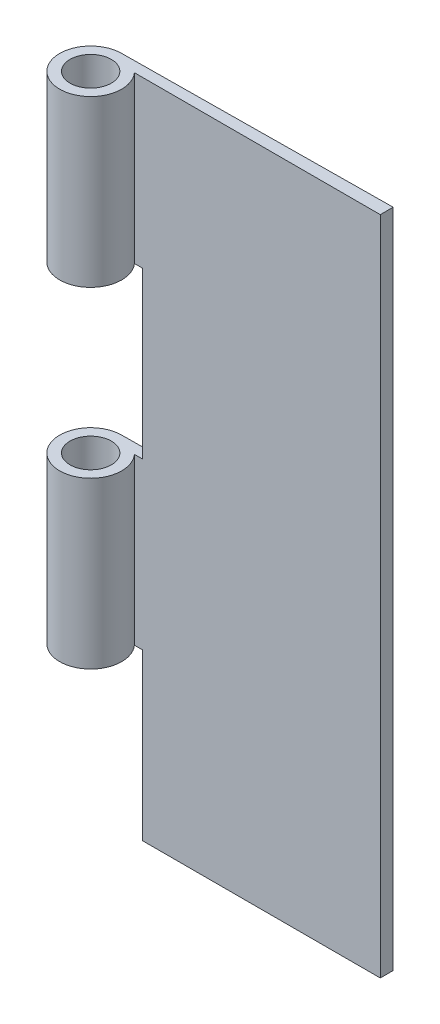
ISO-10303-21;
HEADER;
FILE_DESCRIPTION(('STEP AP214'),'2;1');
FILE_NAME('part.step','',(''),(''),'','','');
FILE_SCHEMA(('AUTOMOTIVE_DESIGN { 1 0 10303 214 1 1 1 1 }'));
ENDSEC;
DATA;
#1=APPLICATION_CONTEXT('core data for automotive mechanical design processes');
#2=APPLICATION_PROTOCOL_DEFINITION('international standard','automotive_design',2000,#1);
#3=PRODUCT_CONTEXT('',#1,'mechanical');
#4=PRODUCT('Part','Part','',(#3));
#5=PRODUCT_RELATED_PRODUCT_CATEGORY('part','',(#4));
#6=PRODUCT_DEFINITION_FORMATION('','',#4);
#7=PRODUCT_DEFINITION_CONTEXT('part definition',#1,'design');
#8=PRODUCT_DEFINITION('design','',#6,#7);
#9=PRODUCT_DEFINITION_SHAPE('','',#8);
#10=(LENGTH_UNIT() NAMED_UNIT(*) SI_UNIT(.MILLI.,.METRE.));
#11=(NAMED_UNIT(*) PLANE_ANGLE_UNIT() SI_UNIT($,.RADIAN.));
#12=(NAMED_UNIT(*) SI_UNIT($,.STERADIAN.) SOLID_ANGLE_UNIT());
#13=UNCERTAINTY_MEASURE_WITH_UNIT(LENGTH_MEASURE(1.E-05),#10,'distance_accuracy_value','');
#14=(GEOMETRIC_REPRESENTATION_CONTEXT(3) GLOBAL_UNCERTAINTY_ASSIGNED_CONTEXT((#13)) GLOBAL_UNIT_ASSIGNED_CONTEXT((#10,
#11,#12)) REPRESENTATION_CONTEXT('',''));
#15=CARTESIAN_POINT('',(0.,0.,0.));
#16=DIRECTION('',(0.,0.,1.));
#17=DIRECTION('',(1.,0.,0.));
#18=AXIS2_PLACEMENT_3D('',#15,#16,#17);
#19=CARTESIAN_POINT('',(130.052474296917,80.,2.75363458868289));
#20=DIRECTION('',(0.,-1.,0.));
#21=DIRECTION('',(0.,0.,-1.));
#22=AXIS2_PLACEMENT_3D('',#19,#20,#21);
#23=CYLINDRICAL_SURFACE('',#22,7.50000000000001);
#24=CARTESIAN_POINT('',(130.052474296917,40.,2.75363458868289));
#25=DIRECTION('',(0.,1.,0.));
#26=DIRECTION('',(-1.,0.,0.));
#27=AXIS2_PLACEMENT_3D('',#24,#25,#26);
#28=CIRCLE('',#27,7.50000000000001);
#29=CARTESIAN_POINT('',(130.052474296917,40.,-4.74636541131713));
#30=VERTEX_POINT('',#29);
#31=CARTESIAN_POINT('',(135.642644240667,40.,-2.2463654113171));
#32=VERTEX_POINT('',#31);
#33=EDGE_CURVE('E151',#30,#32,#28,.T.);
#34=ORIENTED_EDGE('',*,*,#33,.T.);
#35=DIRECTION('',(0.,-1.,0.));
#36=VECTOR('',#35,1.);
#37=CARTESIAN_POINT('',(135.642644240667,80.,-2.24636541131711));
#38=LINE('',#37,#36);
#39=CARTESIAN_POINT('',(135.642644240667,80.,-2.24636541131711));
#40=VERTEX_POINT('',#39);
#41=EDGE_CURVE('E183',#32,#40,#38,.F.);
#42=ORIENTED_EDGE('',*,*,#41,.T.);
#43=CARTESIAN_POINT('',(130.052474296917,80.,2.75363458868289));
#44=DIRECTION('',(0.,1.,0.));
#45=DIRECTION('',(0.,0.,1.));
#46=AXIS2_PLACEMENT_3D('',#43,#44,#45);
#47=CIRCLE('',#46,7.50000000000001);
#48=CARTESIAN_POINT('',(130.052474296917,80.,-4.74636541131713));
#49=VERTEX_POINT('',#48);
#50=EDGE_CURVE('E188',#49,#40,#47,.T.);
#51=ORIENTED_EDGE('',*,*,#50,.F.);
#52=DIRECTION('',(0.,1.,0.));
#53=VECTOR('',#52,1.);
#54=CARTESIAN_POINT('',(130.052474296917,-80.,-4.74636541131713));
#55=LINE('',#54,#53);
#56=EDGE_CURVE('E176',#30,#49,#55,.T.);
#57=ORIENTED_EDGE('',*,*,#56,.F.);
#58=EDGE_LOOP('',(#34,#42,#51,#57));
#59=FACE_BOUND('',#58,.T.);
#60=ADVANCED_FACE('F38',(#59),#23,.T.);
#61=CARTESIAN_POINT('',(130.052474296917,80.,2.75363458868289));
#62=DIRECTION('',(0.,-1.,0.));
#63=DIRECTION('',(0.,0.,-1.));
#64=AXIS2_PLACEMENT_3D('',#61,#62,#63);
#65=CYLINDRICAL_SURFACE('',#64,4.99999999999999);
#66=CARTESIAN_POINT('',(130.052474296917,40.,2.75363458868289));
#67=DIRECTION('',(0.,1.,0.));
#68=DIRECTION('',(-1.,0.,0.));
#69=AXIS2_PLACEMENT_3D('',#66,#67,#68);
#70=CIRCLE('',#69,4.99999999999999);
#71=CARTESIAN_POINT('',(125.052474296917,40.,2.75363458868289));
#72=VERTEX_POINT('',#71);
#73=EDGE_CURVE('E156',#72,#72,#70,.T.);
#74=ORIENTED_EDGE('',*,*,#73,.F.);
#75=EDGE_LOOP('',(#74));
#76=FACE_BOUND('',#75,.T.);
#77=CARTESIAN_POINT('',(130.052474296917,80.,2.75363458868289));
#78=DIRECTION('',(0.,1.,0.));
#79=DIRECTION('',(0.,0.,1.));
#80=AXIS2_PLACEMENT_3D('',#77,#78,#79);
#81=CIRCLE('',#80,4.99999999999999);
#82=CARTESIAN_POINT('',(130.052474296917,80.,7.75363458868288));
#83=VERTEX_POINT('',#82);
#84=EDGE_CURVE('E185',#83,#83,#81,.T.);
#85=ORIENTED_EDGE('',*,*,#84,.T.);
#86=EDGE_LOOP('',(#85));
#87=FACE_BOUND('',#86,.T.);
#88=ADVANCED_FACE('F241',(#76,#87),#65,.F.);
#89=CARTESIAN_POINT('',(130.052474296917,80.,2.75363458868289));
#90=DIRECTION('',(0.,1.,0.));
#91=DIRECTION('',(0.,0.,1.));
#92=AXIS2_PLACEMENT_3D('',#89,#90,#91);
#93=PLANE('',#92);
#94=ORIENTED_EDGE('',*,*,#84,.F.);
#95=EDGE_LOOP('',(#94));
#96=FACE_BOUND('',#95,.T.);
#97=DIRECTION('',(-0.999955368387282,0.,0.00944781633262275));
#98=VECTOR('',#97,1.);
#99=CARTESIAN_POINT('',(130.052474296917,80.,-4.74636541131713));
#100=LINE('',#99,#98);
#101=CARTESIAN_POINT('',(195.14104532459,80.,-5.3613377229455));
#102=VERTEX_POINT('',#101);
#103=EDGE_CURVE('E163',#102,#49,#100,.T.);
#104=ORIENTED_EDGE('',*,*,#103,.T.);
#105=ORIENTED_EDGE('',*,*,#50,.T.);
#106=DIRECTION('',(1.,0.,0.));
#107=VECTOR('',#106,1.);
#108=CARTESIAN_POINT('',(130.052474296917,80.,-2.24636541131711));
#109=LINE('',#108,#107);
#110=CARTESIAN_POINT('',(195.14104532459,80.,-2.24636541131711));
#111=VERTEX_POINT('',#110);
#112=EDGE_CURVE('E159',#40,#111,#109,.T.);
#113=ORIENTED_EDGE('',*,*,#112,.T.);
#114=DIRECTION('',(0.,0.,-1.));
#115=VECTOR('',#114,1.);
#116=CARTESIAN_POINT('',(195.14104532459,80.,-2.24636541131711));
#117=LINE('',#116,#115);
#118=EDGE_CURVE('E171',#111,#102,#117,.T.);
#119=ORIENTED_EDGE('',*,*,#118,.T.);
#120=EDGE_LOOP('',(#104,#105,#113,#119));
#121=FACE_BOUND('',#120,.T.);
#122=ADVANCED_FACE('F226',(#96,#121),#93,.T.);
#123=CARTESIAN_POINT('',(130.052474296917,-80.,2.75363458868289));
#124=DIRECTION('',(0.,1.,0.));
#125=DIRECTION('',(0.,0.,1.));
#126=AXIS2_PLACEMENT_3D('',#123,#124,#125);
#127=PLANE('',#126);
#128=DIRECTION('',(1.,0.,0.));
#129=VECTOR('',#128,1.);
#130=CARTESIAN_POINT('',(130.052474296917,-80.,-2.24636541131711));
#131=LINE('',#130,#129);
#132=CARTESIAN_POINT('',(137.552474296917,-80.,-2.24636541131711));
#133=VERTEX_POINT('',#132);
#134=CARTESIAN_POINT('',(195.14104532459,-80.,-2.24636541131711));
#135=VERTEX_POINT('',#134);
#136=EDGE_CURVE('E160',#133,#135,#131,.T.);
#137=ORIENTED_EDGE('',*,*,#136,.F.);
#138=DIRECTION('',(0.,0.,-1.));
#139=VECTOR('',#138,1.);
#140=CARTESIAN_POINT('',(137.552474296917,-80.,2.75363458868289));
#141=LINE('',#140,#139);
#142=CARTESIAN_POINT('',(137.552474296917,-80.,-4.81722719648755));
#143=VERTEX_POINT('',#142);
#144=EDGE_CURVE('E116',#133,#143,#141,.T.);
#145=ORIENTED_EDGE('',*,*,#144,.T.);
#146=DIRECTION('',(-0.999955368387282,0.,0.00944781633262275));
#147=VECTOR('',#146,1.);
#148=CARTESIAN_POINT('',(130.052474296917,-80.,-4.74636541131713));
#149=LINE('',#148,#147);
#150=CARTESIAN_POINT('',(195.14104532459,-80.,-5.3613377229455));
#151=VERTEX_POINT('',#150);
#152=EDGE_CURVE('E166',#151,#143,#149,.T.);
#153=ORIENTED_EDGE('',*,*,#152,.F.);
#154=DIRECTION('',(0.,0.,-1.));
#155=VECTOR('',#154,1.);
#156=CARTESIAN_POINT('',(195.14104532459,-80.,-2.24636541131711));
#157=LINE('',#156,#155);
#158=EDGE_CURVE('E162',#135,#151,#157,.T.);
#159=ORIENTED_EDGE('',*,*,#158,.F.);
#160=EDGE_LOOP('',(#137,#145,#153,#159));
#161=FACE_BOUND('',#160,.T.);
#162=ADVANCED_FACE('F212',(#161),#127,.F.);
#163=CARTESIAN_POINT('',(130.052474296917,0.,2.75363458868289));
#164=DIRECTION('',(0.,-1.,0.));
#165=DIRECTION('',(1.,0.,0.));
#166=AXIS2_PLACEMENT_3D('',#163,#164,#165);
#167=CIRCLE('',#166,7.50000000000001);
#168=CARTESIAN_POINT('',(135.642644240667,0.,-2.2463654113171));
#169=VERTEX_POINT('',#168);
#170=CARTESIAN_POINT('',(130.052474296917,0.,-4.74636541131713));
#171=VERTEX_POINT('',#170);
#172=EDGE_CURVE('E139',#169,#171,#167,.T.);
#173=ORIENTED_EDGE('',*,*,#172,.T.);
#174=CARTESIAN_POINT('',(130.052474296917,-40.,-4.74636541131713));
#175=VERTEX_POINT('',#174);
#176=EDGE_CURVE('E178',#175,#171,#55,.T.);
#177=ORIENTED_EDGE('',*,*,#176,.F.);
#178=CARTESIAN_POINT('',(130.052474296917,-40.,2.75363458868289));
#179=DIRECTION('',(0.,1.,0.));
#180=DIRECTION('',(0.,0.,1.));
#181=AXIS2_PLACEMENT_3D('',#178,#179,#180);
#182=CIRCLE('',#181,7.50000000000001);
#183=CARTESIAN_POINT('',(135.642644240667,-40.,-2.2463654113171));
#184=VERTEX_POINT('',#183);
#185=EDGE_CURVE('E120',#175,#184,#182,.T.);
#186=ORIENTED_EDGE('',*,*,#185,.T.);
#187=EDGE_CURVE('E135',#184,#169,#38,.F.);
#188=ORIENTED_EDGE('',*,*,#187,.T.);
#189=EDGE_LOOP('',(#173,#177,#186,#188));
#190=FACE_BOUND('',#189,.T.);
#191=ADVANCED_FACE('F40',(#190),#23,.T.);
#192=CARTESIAN_POINT('',(130.052474296917,-80.,-2.24636541131711));
#193=DIRECTION('',(0.,0.,1.));
#194=DIRECTION('',(1.,0.,0.));
#195=AXIS2_PLACEMENT_3D('',#192,#193,#194);
#196=PLANE('',#195);
#197=DIRECTION('',(-1.,0.,0.));
#198=VECTOR('',#197,1.);
#199=CARTESIAN_POINT('',(130.052474296917,40.,-2.24636541131711));
#200=LINE('',#199,#198);
#201=CARTESIAN_POINT('',(137.552474296917,40.,-2.24636541131711));
#202=VERTEX_POINT('',#201);
#203=EDGE_CURVE('E153',#202,#32,#200,.T.);
#204=ORIENTED_EDGE('',*,*,#203,.F.);
#205=DIRECTION('',(0.,1.,0.));
#206=VECTOR('',#205,1.);
#207=CARTESIAN_POINT('',(137.552474296917,-80.,-2.24636541131711));
#208=LINE('',#207,#206);
#209=CARTESIAN_POINT('',(137.552474296917,0.,-2.24636541131711));
#210=VERTEX_POINT('',#209);
#211=EDGE_CURVE('E149',#210,#202,#208,.T.);
#212=ORIENTED_EDGE('',*,*,#211,.F.);
#213=DIRECTION('',(1.,0.,0.));
#214=VECTOR('',#213,1.);
#215=CARTESIAN_POINT('',(130.052474296917,0.,-2.24636541131711));
#216=LINE('',#215,#214);
#217=EDGE_CURVE('E144',#169,#210,#216,.T.);
#218=ORIENTED_EDGE('',*,*,#217,.F.);
#219=ORIENTED_EDGE('',*,*,#187,.F.);
#220=DIRECTION('',(-1.,0.,0.));
#221=VECTOR('',#220,1.);
#222=CARTESIAN_POINT('',(130.052474296917,-40.,-2.24636541131711));
#223=LINE('',#222,#221);
#224=CARTESIAN_POINT('',(137.552474296917,-40.,-2.24636541131711));
#225=VERTEX_POINT('',#224);
#226=EDGE_CURVE('E125',#225,#184,#223,.T.);
#227=ORIENTED_EDGE('',*,*,#226,.F.);
#228=DIRECTION('',(0.,1.,0.));
#229=VECTOR('',#228,1.);
#230=CARTESIAN_POINT('',(137.552474296917,-80.,-2.24636541131711));
#231=LINE('',#230,#229);
#232=EDGE_CURVE('E113',#133,#225,#231,.T.);
#233=ORIENTED_EDGE('',*,*,#232,.F.);
#234=ORIENTED_EDGE('',*,*,#136,.T.);
#235=DIRECTION('',(0.,1.,0.));
#236=VECTOR('',#235,1.);
#237=CARTESIAN_POINT('',(195.14104532459,-80.,-2.24636541131711));
#238=LINE('',#237,#236);
#239=EDGE_CURVE('E169',#135,#111,#238,.T.);
#240=ORIENTED_EDGE('',*,*,#239,.T.);
#241=ORIENTED_EDGE('',*,*,#112,.F.);
#242=ORIENTED_EDGE('',*,*,#41,.F.);
#243=EDGE_LOOP('',(#204,#212,#218,#219,#227,#233,#234,#240,#241,#242));
#244=FACE_BOUND('',#243,.T.);
#245=ADVANCED_FACE('F132',(#244),#196,.T.);
#246=CARTESIAN_POINT('',(130.052474296917,-80.,-4.74636541131713));
#247=DIRECTION('',(-0.00944781633262275,0.,-0.999955368387282));
#248=DIRECTION('',(-0.999955368387282,0.,0.00944781633262275));
#249=AXIS2_PLACEMENT_3D('',#246,#247,#248);
#250=PLANE('',#249);
#251=DIRECTION('',(0.999955368387282,0.,-0.00944781633262275));
#252=VECTOR('',#251,1.);
#253=CARTESIAN_POINT('',(130.052474296917,40.,-4.74636541131713));
#254=LINE('',#253,#252);
#255=CARTESIAN_POINT('',(137.552474296917,40.,-4.81722719648755));
#256=VERTEX_POINT('',#255);
#257=EDGE_CURVE('E11',#30,#256,#254,.T.);
#258=ORIENTED_EDGE('',*,*,#257,.F.);
#259=ORIENTED_EDGE('',*,*,#56,.T.);
#260=ORIENTED_EDGE('',*,*,#103,.F.);
#261=DIRECTION('',(0.,1.,0.));
#262=VECTOR('',#261,1.);
#263=CARTESIAN_POINT('',(195.14104532459,-80.,-5.3613377229455));
#264=LINE('',#263,#262);
#265=EDGE_CURVE('E179',#151,#102,#264,.T.);
#266=ORIENTED_EDGE('',*,*,#265,.F.);
#267=ORIENTED_EDGE('',*,*,#152,.T.);
#268=DIRECTION('',(0.,-1.,0.));
#269=VECTOR('',#268,1.);
#270=CARTESIAN_POINT('',(137.552474296917,-80.,-4.81722719648755));
#271=LINE('',#270,#269);
#272=CARTESIAN_POINT('',(137.552474296917,-40.,-4.81722719648755));
#273=VERTEX_POINT('',#272);
#274=EDGE_CURVE('E191',#273,#143,#271,.T.);
#275=ORIENTED_EDGE('',*,*,#274,.F.);
#276=DIRECTION('',(0.999955368387282,0.,-0.00944781633262275));
#277=VECTOR('',#276,1.);
#278=CARTESIAN_POINT('',(130.052474296917,-40.,-4.74636541131713));
#279=LINE('',#278,#277);
#280=EDGE_CURVE('E128',#175,#273,#279,.T.);
#281=ORIENTED_EDGE('',*,*,#280,.F.);
#282=ORIENTED_EDGE('',*,*,#176,.T.);
#283=DIRECTION('',(-0.999955368387282,0.,0.00944781633262275));
#284=VECTOR('',#283,1.);
#285=CARTESIAN_POINT('',(130.052474296917,0.,-4.74636541131713));
#286=LINE('',#285,#284);
#287=CARTESIAN_POINT('',(137.552474296917,0.,-4.81722719648755));
#288=VERTEX_POINT('',#287);
#289=EDGE_CURVE('E194',#288,#171,#286,.T.);
#290=ORIENTED_EDGE('',*,*,#289,.F.);
#291=DIRECTION('',(0.,-1.,0.));
#292=VECTOR('',#291,1.);
#293=CARTESIAN_POINT('',(137.552474296917,-80.,-4.81722719648755));
#294=LINE('',#293,#292);
#295=EDGE_CURVE('E46',#256,#288,#294,.T.);
#296=ORIENTED_EDGE('',*,*,#295,.F.);
#297=EDGE_LOOP('',(#258,#259,#260,#266,#267,#275,#281,#282,#290,#296));
#298=FACE_BOUND('',#297,.T.);
#299=ADVANCED_FACE('F206',(#298),#250,.T.);
#300=CARTESIAN_POINT('',(195.14104532459,-80.,-2.24636541131711));
#301=DIRECTION('',(1.,0.,0.));
#302=DIRECTION('',(0.,0.,-1.));
#303=AXIS2_PLACEMENT_3D('',#300,#301,#302);
#304=PLANE('',#303);
#305=ORIENTED_EDGE('',*,*,#118,.F.);
#306=ORIENTED_EDGE('',*,*,#239,.F.);
#307=ORIENTED_EDGE('',*,*,#158,.T.);
#308=ORIENTED_EDGE('',*,*,#265,.T.);
#309=EDGE_LOOP('',(#305,#306,#307,#308));
#310=FACE_BOUND('',#309,.T.);
#311=ADVANCED_FACE('F230',(#310),#304,.T.);
#312=CARTESIAN_POINT('',(137.552474296917,-40.,-5.3613377229455));
#313=DIRECTION('',(1.,0.,0.));
#314=DIRECTION('',(0.,1.,0.));
#315=AXIS2_PLACEMENT_3D('',#312,#313,#314);
#316=PLANE('',#315);
#317=ORIENTED_EDGE('',*,*,#232,.T.);
#318=DIRECTION('',(0.,0.,1.));
#319=VECTOR('',#318,1.);
#320=CARTESIAN_POINT('',(137.552474296917,-40.,-5.3613377229455));
#321=LINE('',#320,#319);
#322=EDGE_CURVE('E61',#273,#225,#321,.T.);
#323=ORIENTED_EDGE('',*,*,#322,.F.);
#324=ORIENTED_EDGE('',*,*,#274,.T.);
#325=ORIENTED_EDGE('',*,*,#144,.F.);
#326=EDGE_LOOP('',(#317,#323,#324,#325));
#327=FACE_BOUND('',#326,.T.);
#328=ADVANCED_FACE('F114',(#327),#316,.F.);
#329=CARTESIAN_POINT('',(107.599116552244,-40.,-5.3613377229455));
#330=DIRECTION('',(0.,1.,0.));
#331=DIRECTION('',(0.,0.,1.));
#332=AXIS2_PLACEMENT_3D('',#329,#330,#331);
#333=PLANE('',#332);
#334=CARTESIAN_POINT('',(130.052474296917,-40.,2.75363458868289));
#335=DIRECTION('',(0.,1.,0.));
#336=DIRECTION('',(0.,0.,1.));
#337=AXIS2_PLACEMENT_3D('',#334,#335,#336);
#338=CIRCLE('',#337,4.99999999999999);
#339=CARTESIAN_POINT('',(130.052474296917,-40.,-2.24636541131711));
#340=VERTEX_POINT('',#339);
#341=EDGE_CURVE('E136',#340,#340,#338,.T.);
#342=ORIENTED_EDGE('',*,*,#341,.T.);
#343=EDGE_LOOP('',(#342));
#344=FACE_BOUND('',#343,.T.);
#345=ORIENTED_EDGE('',*,*,#226,.T.);
#346=ORIENTED_EDGE('',*,*,#185,.F.);
#347=ORIENTED_EDGE('',*,*,#280,.T.);
#348=ORIENTED_EDGE('',*,*,#322,.T.);
#349=EDGE_LOOP('',(#345,#346,#347,#348));
#350=FACE_BOUND('',#349,.T.);
#351=ADVANCED_FACE('F124',(#344,#350),#333,.F.);
#352=CARTESIAN_POINT('',(101.023989242437,40.,-5.3613377229455));
#353=DIRECTION('',(0.,1.,0.));
#354=DIRECTION('',(-1.,0.,0.));
#355=AXIS2_PLACEMENT_3D('',#352,#353,#354);
#356=PLANE('',#355);
#357=ORIENTED_EDGE('',*,*,#73,.T.);
#358=EDGE_LOOP('',(#357));
#359=FACE_BOUND('',#358,.T.);
#360=ORIENTED_EDGE('',*,*,#203,.T.);
#361=ORIENTED_EDGE('',*,*,#33,.F.);
#362=ORIENTED_EDGE('',*,*,#257,.T.);
#363=DIRECTION('',(0.,0.,1.));
#364=VECTOR('',#363,1.);
#365=CARTESIAN_POINT('',(137.552474296917,40.,-5.3613377229455));
#366=LINE('',#365,#364);
#367=EDGE_CURVE('E202',#256,#202,#366,.T.);
#368=ORIENTED_EDGE('',*,*,#367,.T.);
#369=EDGE_LOOP('',(#360,#361,#362,#368));
#370=FACE_BOUND('',#369,.T.);
#371=ADVANCED_FACE('F218',(#359,#370),#356,.F.);
#372=CARTESIAN_POINT('',(137.552474296917,0.,-5.3613377229455));
#373=DIRECTION('',(0.,-1.,0.));
#374=DIRECTION('',(1.,0.,0.));
#375=AXIS2_PLACEMENT_3D('',#372,#373,#374);
#376=PLANE('',#375);
#377=CARTESIAN_POINT('',(130.052474296917,0.,2.75363458868289));
#378=DIRECTION('',(0.,-1.,0.));
#379=DIRECTION('',(1.,0.,0.));
#380=AXIS2_PLACEMENT_3D('',#377,#378,#379);
#381=CIRCLE('',#380,4.99999999999999);
#382=CARTESIAN_POINT('',(130.052474296917,0.,-2.24636541131711));
#383=VERTEX_POINT('',#382);
#384=EDGE_CURVE('E146',#383,#383,#381,.T.);
#385=ORIENTED_EDGE('',*,*,#384,.T.);
#386=EDGE_LOOP('',(#385));
#387=FACE_BOUND('',#386,.T.);
#388=ORIENTED_EDGE('',*,*,#217,.T.);
#389=DIRECTION('',(0.,0.,1.));
#390=VECTOR('',#389,1.);
#391=CARTESIAN_POINT('',(137.552474296917,0.,-5.3613377229455));
#392=LINE('',#391,#390);
#393=EDGE_CURVE('E53',#288,#210,#392,.T.);
#394=ORIENTED_EDGE('',*,*,#393,.F.);
#395=ORIENTED_EDGE('',*,*,#289,.T.);
#396=ORIENTED_EDGE('',*,*,#172,.F.);
#397=EDGE_LOOP('',(#388,#394,#395,#396));
#398=FACE_BOUND('',#397,.T.);
#399=ADVANCED_FACE('F208',(#387,#398),#376,.F.);
#400=CARTESIAN_POINT('',(137.552474296917,40.,-5.3613377229455));
#401=DIRECTION('',(1.,0.,0.));
#402=DIRECTION('',(0.,0.,-1.));
#403=AXIS2_PLACEMENT_3D('',#400,#401,#402);
#404=PLANE('',#403);
#405=ORIENTED_EDGE('',*,*,#211,.T.);
#406=ORIENTED_EDGE('',*,*,#367,.F.);
#407=ORIENTED_EDGE('',*,*,#295,.T.);
#408=ORIENTED_EDGE('',*,*,#393,.T.);
#409=EDGE_LOOP('',(#405,#406,#407,#408));
#410=FACE_BOUND('',#409,.T.);
#411=ADVANCED_FACE('F199',(#410),#404,.F.);
#412=CARTESIAN_POINT('',(130.052474296917,0.,-2.24636541131711));
#413=CARTESIAN_POINT('',(130.052474296917,-0.416666666666653,-2.24636541131711));
#414=CARTESIAN_POINT('',(130.052474296917,-0.83333333333332,-2.24636541131711));
#415=CARTESIAN_POINT('',(130.052474296917,-1.66666666666665,-2.24636541131711));
#416=CARTESIAN_POINT('',(130.052474296917,-2.08333333333332,-2.24636541131711));
#417=CARTESIAN_POINT('',(130.052474296917,-2.91666666666665,-2.24636541131711));
#418=CARTESIAN_POINT('',(130.052474296917,-3.33333333333332,-2.24636541131711));
#419=CARTESIAN_POINT('',(130.052474296917,-4.16666666666666,-2.24636541131711));
#420=CARTESIAN_POINT('',(130.052474296917,-4.58333333333332,-2.24636541131711));
#421=CARTESIAN_POINT('',(130.052474296917,-5.41666666666666,-2.24636541131711));
#422=CARTESIAN_POINT('',(130.052474296917,-5.83333333333333,-2.24636541131711));
#423=CARTESIAN_POINT('',(130.052474296917,-6.66666666666666,-2.24636541131711));
#424=CARTESIAN_POINT('',(130.052474296917,-7.08333333333333,-2.24636541131711));
#425=CARTESIAN_POINT('',(130.052474296917,-7.91666666666666,-2.24636541131711));
#426=CARTESIAN_POINT('',(130.052474296917,-8.33333333333333,-2.24636541131711));
#427=CARTESIAN_POINT('',(130.052474296917,-9.16666666666666,-2.24636541131711));
#428=CARTESIAN_POINT('',(130.052474296917,-9.58333333333333,-2.24636541131711));
#429=CARTESIAN_POINT('',(130.052474296917,-10.4166666666667,-2.24636541131711));
#430=CARTESIAN_POINT('',(130.052474296917,-10.8333333333333,-2.24636541131711));
#431=CARTESIAN_POINT('',(130.052474296917,-11.6666666666667,-2.24636541131711));
#432=CARTESIAN_POINT('',(130.052474296917,-12.0833333333333,-2.24636541131711));
#433=CARTESIAN_POINT('',(130.052474296917,-12.9166666666667,-2.24636541131711));
#434=CARTESIAN_POINT('',(130.052474296917,-13.3333333333333,-2.24636541131711));
#435=CARTESIAN_POINT('',(130.052474296917,-14.1666666666667,-2.24636541131711));
#436=CARTESIAN_POINT('',(130.052474296917,-14.5833333333333,-2.24636541131711));
#437=CARTESIAN_POINT('',(130.052474296917,-15.4166666666667,-2.24636541131711));
#438=CARTESIAN_POINT('',(130.052474296917,-15.8333333333333,-2.24636541131711));
#439=CARTESIAN_POINT('',(130.052474296917,-16.6666666666667,-2.24636541131711));
#440=CARTESIAN_POINT('',(130.052474296917,-17.0833333333333,-2.24636541131711));
#441=CARTESIAN_POINT('',(130.052474296917,-17.9166666666667,-2.24636541131711));
#442=CARTESIAN_POINT('',(130.052474296917,-18.3333333333333,-2.24636541131711));
#443=CARTESIAN_POINT('',(130.052474296917,-19.1666666666667,-2.24636541131711));
#444=CARTESIAN_POINT('',(130.052474296917,-19.5833333333333,-2.24636541131711));
#445=CARTESIAN_POINT('',(130.052474296917,-20.4166666666667,-2.24636541131711));
#446=CARTESIAN_POINT('',(130.052474296917,-20.8333333333333,-2.24636541131711));
#447=CARTESIAN_POINT('',(130.052474296917,-21.6666666666667,-2.24636541131711));
#448=CARTESIAN_POINT('',(130.052474296917,-22.0833333333333,-2.24636541131711));
#449=CARTESIAN_POINT('',(130.052474296917,-22.9166666666667,-2.24636541131711));
#450=CARTESIAN_POINT('',(130.052474296917,-23.3333333333333,-2.24636541131711));
#451=CARTESIAN_POINT('',(130.052474296917,-24.1666666666667,-2.24636541131711));
#452=CARTESIAN_POINT('',(130.052474296917,-24.5833333333333,-2.24636541131711));
#453=CARTESIAN_POINT('',(130.052474296917,-25.4166666666667,-2.24636541131711));
#454=CARTESIAN_POINT('',(130.052474296917,-25.8333333333333,-2.24636541131711));
#455=CARTESIAN_POINT('',(130.052474296917,-26.6666666666667,-2.24636541131711));
#456=CARTESIAN_POINT('',(130.052474296917,-27.0833333333333,-2.24636541131711));
#457=CARTESIAN_POINT('',(130.052474296917,-27.9166666666667,-2.24636541131711));
#458=CARTESIAN_POINT('',(130.052474296917,-28.3333333333333,-2.24636541131711));
#459=CARTESIAN_POINT('',(130.052474296917,-29.1666666666667,-2.24636541131711));
#460=CARTESIAN_POINT('',(130.052474296917,-29.5833333333333,-2.24636541131711));
#461=CARTESIAN_POINT('',(130.052474296917,-30.4166666666667,-2.24636541131711));
#462=CARTESIAN_POINT('',(130.052474296917,-30.8333333333333,-2.24636541131711));
#463=CARTESIAN_POINT('',(130.052474296917,-31.6666666666667,-2.24636541131711));
#464=CARTESIAN_POINT('',(130.052474296917,-32.0833333333333,-2.24636541131711));
#465=CARTESIAN_POINT('',(130.052474296917,-32.9166666666667,-2.24636541131711));
#466=CARTESIAN_POINT('',(130.052474296917,-33.3333333333333,-2.24636541131711));
#467=CARTESIAN_POINT('',(130.052474296917,-34.1666666666667,-2.24636541131711));
#468=CARTESIAN_POINT('',(130.052474296917,-34.5833333333333,-2.24636541131711));
#469=CARTESIAN_POINT('',(130.052474296917,-35.4166666666667,-2.24636541131711));
#470=CARTESIAN_POINT('',(130.052474296917,-35.8333333333333,-2.24636541131711));
#471=CARTESIAN_POINT('',(130.052474296917,-36.6666666666667,-2.24636541131711));
#472=CARTESIAN_POINT('',(130.052474296917,-37.0833333333333,-2.24636541131711));
#473=CARTESIAN_POINT('',(130.052474296917,-37.9166666666667,-2.24636541131711));
#474=CARTESIAN_POINT('',(130.052474296917,-38.3333333333333,-2.24636541131711));
#475=CARTESIAN_POINT('',(130.052474296917,-39.1666666666667,-2.24636541131711));
#476=CARTESIAN_POINT('',(130.052474296917,-39.5833333333333,-2.24636541131711));
#477=CARTESIAN_POINT('',(130.052474296917,-40.,-2.24636541131711));
#478=B_SPLINE_CURVE_WITH_KNOTS('',3,(#412,#413,#414,#415,#416,#417,#418,#419,#420,#421,#422,
#423,#424,#425,#426,#427,#428,#429,#430,#431,#432,#433,#434,#435,#436,#437,#438,#439,#440,#441,
#442,#443,#444,#445,#446,#447,#448,#449,#450,#451,#452,#453,#454,#455,#456,#457,#458,#459,#460,
#461,#462,#463,#464,#465,#466,#467,#468,#469,#470,#471,#472,#473,#474,#475,#476,#477),
.UNSPECIFIED.,.F.,.F.,(4,2,2,2,2,2,2,2,2,2,2,2,2,2,2,2,2,2,2,2,2,2,2,2,2,2,2,2,2,2,2,2,4),(0.,
1.25,2.5,3.75,5.,6.25000000000001,7.50000000000001,8.75000000000001,10.,11.25,12.5,13.75,15.,
16.25,17.5,18.75,20.,21.25,22.5,23.75,25.,26.25,27.5,28.75,30.,31.25,32.5,33.75,35.,36.25,37.5,
38.75,40.),.UNSPECIFIED.);
#479=EDGE_CURVE('BSEAM247',#383,#340,#478,.T.);
#480=ORIENTED_EDGE('',*,*,#384,.F.);
#481=ORIENTED_EDGE('',*,*,#341,.F.);
#482=ORIENTED_EDGE('',*,*,#479,.T.);
#483=ORIENTED_EDGE('',*,*,#479,.F.);
#484=EDGE_LOOP('',(#480,#482,#481,#483));
#485=FACE_BOUND('',#484,.T.);
#486=ADVANCED_FACE('F247',(#485),#65,.F.);
#487=CLOSED_SHELL('',(#60,#88,#122,#162,#191,#245,#299,#311,#328,#351,#371,#399,#411,#486));
#488=MANIFOLD_SOLID_BREP('B2',#487);
#489=ADVANCED_BREP_SHAPE_REPRESENTATION('',(#18,#488),#14);
#490=SHAPE_DEFINITION_REPRESENTATION(#9,#489);
ENDSEC;
END-ISO-10303-21;
